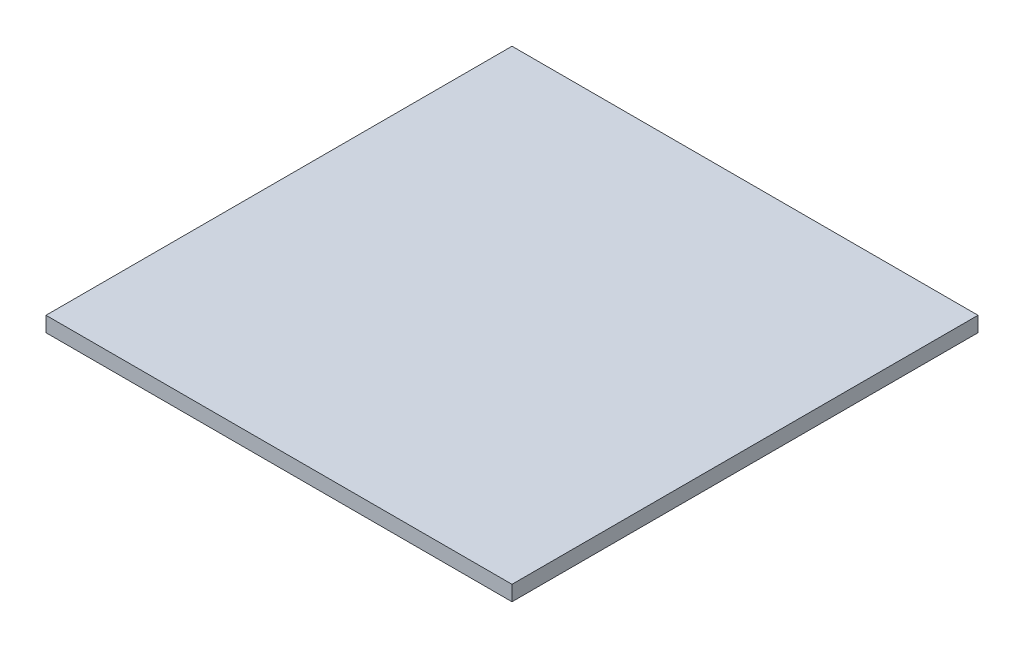
ISO-10303-21;
HEADER;
FILE_DESCRIPTION(('STEP AP214'),'2;1');
FILE_NAME('part.step','',(''),(''),'','','');
FILE_SCHEMA(('AUTOMOTIVE_DESIGN { 1 0 10303 214 1 1 1 1 }'));
ENDSEC;
DATA;
#1=APPLICATION_CONTEXT('core data for automotive mechanical design processes');
#2=APPLICATION_PROTOCOL_DEFINITION('international standard','automotive_design',2000,#1);
#3=PRODUCT_CONTEXT('',#1,'mechanical');
#4=PRODUCT('Part','Part','',(#3));
#5=PRODUCT_RELATED_PRODUCT_CATEGORY('part','',(#4));
#6=PRODUCT_DEFINITION_FORMATION('','',#4);
#7=PRODUCT_DEFINITION_CONTEXT('part definition',#1,'design');
#8=PRODUCT_DEFINITION('design','',#6,#7);
#9=PRODUCT_DEFINITION_SHAPE('','',#8);
#10=(LENGTH_UNIT() NAMED_UNIT(*) SI_UNIT(.MILLI.,.METRE.));
#11=(NAMED_UNIT(*) PLANE_ANGLE_UNIT() SI_UNIT($,.RADIAN.));
#12=(NAMED_UNIT(*) SI_UNIT($,.STERADIAN.) SOLID_ANGLE_UNIT());
#13=UNCERTAINTY_MEASURE_WITH_UNIT(LENGTH_MEASURE(1.E-05),#10,'distance_accuracy_value','');
#14=(GEOMETRIC_REPRESENTATION_CONTEXT(3) GLOBAL_UNCERTAINTY_ASSIGNED_CONTEXT((#13)) GLOBAL_UNIT_ASSIGNED_CONTEXT((#10,
#11,#12)) REPRESENTATION_CONTEXT('',''));
#15=CARTESIAN_POINT('',(0.,0.,0.));
#16=DIRECTION('',(0.,0.,1.));
#17=DIRECTION('',(1.,0.,0.));
#18=AXIS2_PLACEMENT_3D('',#15,#16,#17);
#19=CARTESIAN_POINT('',(-200.,13.,-200.));
#20=DIRECTION('',(1.,0.,0.));
#21=DIRECTION('',(0.,0.,-1.));
#22=AXIS2_PLACEMENT_3D('',#19,#20,#21);
#23=PLANE('',#22);
#24=DIRECTION('',(0.,0.,1.));
#25=VECTOR('',#24,1.);
#26=CARTESIAN_POINT('',(-200.,0.,-200.));
#27=LINE('',#26,#25);
#28=CARTESIAN_POINT('',(-200.,0.,-200.));
#29=VERTEX_POINT('',#28);
#30=CARTESIAN_POINT('',(-200.,0.,200.));
#31=VERTEX_POINT('',#30);
#32=EDGE_CURVE('E107',#29,#31,#27,.T.);
#33=ORIENTED_EDGE('',*,*,#32,.T.);
#34=DIRECTION('',(0.,-1.,0.));
#35=VECTOR('',#34,1.);
#36=CARTESIAN_POINT('',(-200.,13.,200.));
#37=LINE('',#36,#35);
#38=CARTESIAN_POINT('',(-200.,13.,200.));
#39=VERTEX_POINT('',#38);
#40=EDGE_CURVE('E11',#39,#31,#37,.T.);
#41=ORIENTED_EDGE('',*,*,#40,.F.);
#42=DIRECTION('',(0.,0.,1.));
#43=VECTOR('',#42,1.);
#44=CARTESIAN_POINT('',(-200.,13.,-200.));
#45=LINE('',#44,#43);
#46=CARTESIAN_POINT('',(-200.,13.,-200.));
#47=VERTEX_POINT('',#46);
#48=EDGE_CURVE('E91',#47,#39,#45,.T.);
#49=ORIENTED_EDGE('',*,*,#48,.F.);
#50=DIRECTION('',(0.,-1.,0.));
#51=VECTOR('',#50,1.);
#52=CARTESIAN_POINT('',(-200.,13.,-200.));
#53=LINE('',#52,#51);
#54=EDGE_CURVE('E103',#47,#29,#53,.T.);
#55=ORIENTED_EDGE('',*,*,#54,.T.);
#56=EDGE_LOOP('',(#33,#41,#49,#55));
#57=FACE_BOUND('',#56,.T.);
#58=ADVANCED_FACE('F39',(#57),#23,.F.);
#59=CARTESIAN_POINT('',(200.,13.,200.));
#60=DIRECTION('',(0.,0.,-1.));
#61=DIRECTION('',(-1.,0.,0.));
#62=AXIS2_PLACEMENT_3D('',#59,#60,#61);
#63=PLANE('',#62);
#64=DIRECTION('',(1.,0.,0.));
#65=VECTOR('',#64,1.);
#66=CARTESIAN_POINT('',(200.,0.,200.));
#67=LINE('',#66,#65);
#68=CARTESIAN_POINT('',(200.,0.,200.));
#69=VERTEX_POINT('',#68);
#70=EDGE_CURVE('E96',#31,#69,#67,.T.);
#71=ORIENTED_EDGE('',*,*,#70,.T.);
#72=DIRECTION('',(0.,-1.,0.));
#73=VECTOR('',#72,1.);
#74=CARTESIAN_POINT('',(200.,13.,200.));
#75=LINE('',#74,#73);
#76=CARTESIAN_POINT('',(200.,13.,200.));
#77=VERTEX_POINT('',#76);
#78=EDGE_CURVE('E48',#77,#69,#75,.T.);
#79=ORIENTED_EDGE('',*,*,#78,.F.);
#80=DIRECTION('',(1.,0.,0.));
#81=VECTOR('',#80,1.);
#82=CARTESIAN_POINT('',(200.,13.,200.));
#83=LINE('',#82,#81);
#84=EDGE_CURVE('E86',#39,#77,#83,.T.);
#85=ORIENTED_EDGE('',*,*,#84,.F.);
#86=ORIENTED_EDGE('',*,*,#40,.T.);
#87=EDGE_LOOP('',(#71,#79,#85,#86));
#88=FACE_BOUND('',#87,.T.);
#89=ADVANCED_FACE('F95',(#88),#63,.F.);
#90=CARTESIAN_POINT('',(200.,13.,-200.));
#91=DIRECTION('',(-1.,0.,0.));
#92=DIRECTION('',(0.,0.,1.));
#93=AXIS2_PLACEMENT_3D('',#90,#91,#92);
#94=PLANE('',#93);
#95=DIRECTION('',(0.,0.,-1.));
#96=VECTOR('',#95,1.);
#97=CARTESIAN_POINT('',(200.,0.,-200.));
#98=LINE('',#97,#96);
#99=CARTESIAN_POINT('',(200.,0.,-200.));
#100=VERTEX_POINT('',#99);
#101=EDGE_CURVE('E73',#69,#100,#98,.T.);
#102=ORIENTED_EDGE('',*,*,#101,.T.);
#103=DIRECTION('',(0.,-1.,0.));
#104=VECTOR('',#103,1.);
#105=CARTESIAN_POINT('',(200.,13.,-200.));
#106=LINE('',#105,#104);
#107=CARTESIAN_POINT('',(200.,13.,-200.));
#108=VERTEX_POINT('',#107);
#109=EDGE_CURVE('E98',#108,#100,#106,.T.);
#110=ORIENTED_EDGE('',*,*,#109,.F.);
#111=DIRECTION('',(0.,0.,-1.));
#112=VECTOR('',#111,1.);
#113=CARTESIAN_POINT('',(200.,13.,-200.));
#114=LINE('',#113,#112);
#115=EDGE_CURVE('E89',#77,#108,#114,.T.);
#116=ORIENTED_EDGE('',*,*,#115,.F.);
#117=ORIENTED_EDGE('',*,*,#78,.T.);
#118=EDGE_LOOP('',(#102,#110,#116,#117));
#119=FACE_BOUND('',#118,.T.);
#120=ADVANCED_FACE('F99',(#119),#94,.F.);
#121=CARTESIAN_POINT('',(200.,13.,-200.));
#122=DIRECTION('',(0.,0.,1.));
#123=DIRECTION('',(1.,0.,0.));
#124=AXIS2_PLACEMENT_3D('',#121,#122,#123);
#125=PLANE('',#124);
#126=DIRECTION('',(-1.,0.,0.));
#127=VECTOR('',#126,1.);
#128=CARTESIAN_POINT('',(200.,0.,-200.));
#129=LINE('',#128,#127);
#130=EDGE_CURVE('E79',#100,#29,#129,.T.);
#131=ORIENTED_EDGE('',*,*,#130,.T.);
#132=ORIENTED_EDGE('',*,*,#54,.F.);
#133=DIRECTION('',(-1.,0.,0.));
#134=VECTOR('',#133,1.);
#135=CARTESIAN_POINT('',(200.,13.,-200.));
#136=LINE('',#135,#134);
#137=EDGE_CURVE('E56',#108,#47,#136,.T.);
#138=ORIENTED_EDGE('',*,*,#137,.F.);
#139=ORIENTED_EDGE('',*,*,#109,.T.);
#140=EDGE_LOOP('',(#131,#132,#138,#139));
#141=FACE_BOUND('',#140,.T.);
#142=ADVANCED_FACE('F120',(#141),#125,.F.);
#143=CARTESIAN_POINT('',(0.,13.,0.));
#144=DIRECTION('',(0.,-1.,0.));
#145=DIRECTION('',(0.,0.,-1.));
#146=AXIS2_PLACEMENT_3D('',#143,#144,#145);
#147=PLANE('',#146);
#148=ORIENTED_EDGE('',*,*,#48,.T.);
#149=ORIENTED_EDGE('',*,*,#84,.T.);
#150=ORIENTED_EDGE('',*,*,#115,.T.);
#151=ORIENTED_EDGE('',*,*,#137,.T.);
#152=EDGE_LOOP('',(#148,#149,#150,#151));
#153=FACE_BOUND('',#152,.T.);
#154=ADVANCED_FACE('F87',(#153),#147,.F.);
#155=CARTESIAN_POINT('',(0.,0.,0.));
#156=DIRECTION('',(0.,-1.,0.));
#157=DIRECTION('',(0.,0.,-1.));
#158=AXIS2_PLACEMENT_3D('',#155,#156,#157);
#159=PLANE('',#158);
#160=ORIENTED_EDGE('',*,*,#32,.F.);
#161=ORIENTED_EDGE('',*,*,#130,.F.);
#162=ORIENTED_EDGE('',*,*,#101,.F.);
#163=ORIENTED_EDGE('',*,*,#70,.F.);
#164=EDGE_LOOP('',(#160,#161,#162,#163));
#165=FACE_BOUND('',#164,.T.);
#166=ADVANCED_FACE('F123',(#165),#159,.T.);
#167=CLOSED_SHELL('',(#58,#89,#120,#142,#154,#166));
#168=MANIFOLD_SOLID_BREP('B2',#167);
#169=ADVANCED_BREP_SHAPE_REPRESENTATION('',(#18,#168),#14);
#170=SHAPE_DEFINITION_REPRESENTATION(#9,#169);
ENDSEC;
END-ISO-10303-21;
